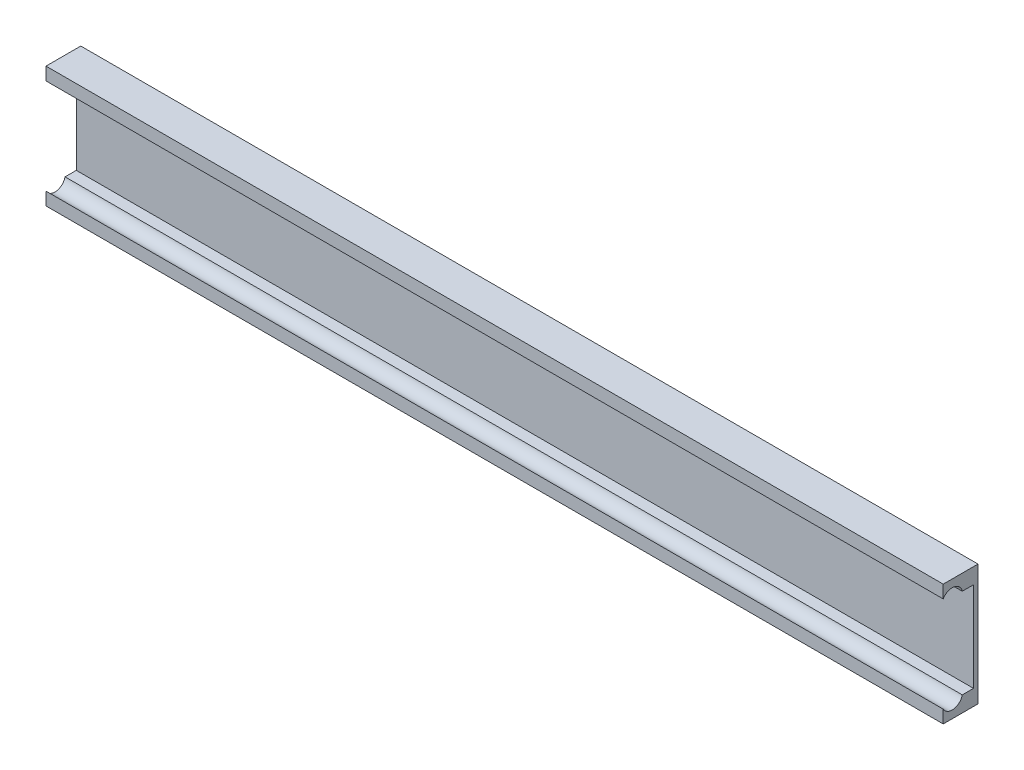
ISO-10303-21;
HEADER;
FILE_DESCRIPTION(('STEP AP214'),'2;1');
FILE_NAME('part.step','',(''),(''),'','','');
FILE_SCHEMA(('AUTOMOTIVE_DESIGN { 1 0 10303 214 1 1 1 1 }'));
ENDSEC;
DATA;
#1=APPLICATION_CONTEXT('core data for automotive mechanical design processes');
#2=APPLICATION_PROTOCOL_DEFINITION('international standard','automotive_design',2000,#1);
#3=PRODUCT_CONTEXT('',#1,'mechanical');
#4=PRODUCT('Part','Part','',(#3));
#5=PRODUCT_RELATED_PRODUCT_CATEGORY('part','',(#4));
#6=PRODUCT_DEFINITION_FORMATION('','',#4);
#7=PRODUCT_DEFINITION_CONTEXT('part definition',#1,'design');
#8=PRODUCT_DEFINITION('design','',#6,#7);
#9=PRODUCT_DEFINITION_SHAPE('','',#8);
#10=(LENGTH_UNIT() NAMED_UNIT(*) SI_UNIT(.MILLI.,.METRE.));
#11=(NAMED_UNIT(*) PLANE_ANGLE_UNIT() SI_UNIT($,.RADIAN.));
#12=(NAMED_UNIT(*) SI_UNIT($,.STERADIAN.) SOLID_ANGLE_UNIT());
#13=UNCERTAINTY_MEASURE_WITH_UNIT(LENGTH_MEASURE(1.E-05),#10,'distance_accuracy_value','');
#14=(GEOMETRIC_REPRESENTATION_CONTEXT(3) GLOBAL_UNCERTAINTY_ASSIGNED_CONTEXT((#13)) GLOBAL_UNIT_ASSIGNED_CONTEXT((#10,
#11,#12)) REPRESENTATION_CONTEXT('',''));
#15=CARTESIAN_POINT('',(0.,0.,0.));
#16=DIRECTION('',(0.,0.,1.));
#17=DIRECTION('',(1.,0.,0.));
#18=AXIS2_PLACEMENT_3D('',#15,#16,#17);
#19=CARTESIAN_POINT('',(100.,-10.,206.780622655632));
#20=DIRECTION('',(0.,-1.,0.));
#21=DIRECTION('',(1.,0.,0.));
#22=AXIS2_PLACEMENT_3D('',#19,#20,#21);
#23=PLANE('',#22);
#24=DIRECTION('',(1.,0.,0.));
#25=VECTOR('',#24,1.);
#26=CARTESIAN_POINT('',(-100.,-10.,2.50500556793565));
#27=LINE('',#26,#25);
#28=CARTESIAN_POINT('',(100.,-10.,2.50500556793564));
#29=VERTEX_POINT('',#28);
#30=CARTESIAN_POINT('',(-100.,-10.,2.50500556793565));
#31=VERTEX_POINT('',#30);
#32=EDGE_CURVE('E124',#29,#31,#27,.F.);
#33=ORIENTED_EDGE('',*,*,#32,.F.);
#34=DIRECTION('',(0.,0.,-1.));
#35=VECTOR('',#34,1.);
#36=CARTESIAN_POINT('',(100.,-10.,206.780622655632));
#37=LINE('',#36,#35);
#38=CARTESIAN_POINT('',(100.,-10.,0.));
#39=VERTEX_POINT('',#38);
#40=EDGE_CURVE('E133',#29,#39,#37,.T.);
#41=ORIENTED_EDGE('',*,*,#40,.T.);
#42=DIRECTION('',(-1.,0.,0.));
#43=VECTOR('',#42,1.);
#44=CARTESIAN_POINT('',(100.,-10.,0.));
#45=LINE('',#44,#43);
#46=CARTESIAN_POINT('',(-100.,-10.,0.));
#47=VERTEX_POINT('',#46);
#48=EDGE_CURVE('E143',#39,#47,#45,.T.);
#49=ORIENTED_EDGE('',*,*,#48,.T.);
#50=DIRECTION('',(0.,0.,-1.));
#51=VECTOR('',#50,1.);
#52=CARTESIAN_POINT('',(-100.,-10.,206.780622655632));
#53=LINE('',#52,#51);
#54=EDGE_CURVE('E135',#31,#47,#53,.T.);
#55=ORIENTED_EDGE('',*,*,#54,.F.);
#56=EDGE_LOOP('',(#33,#41,#49,#55));
#57=FACE_BOUND('',#56,.T.);
#58=ADVANCED_FACE('F43',(#57),#23,.F.);
#59=CARTESIAN_POINT('',(0.,0.,6.75));
#60=DIRECTION('',(0.,0.,1.));
#61=DIRECTION('',(1.,0.,0.));
#62=AXIS2_PLACEMENT_3D('',#59,#60,#61);
#63=PLANE('',#62);
#64=DIRECTION('',(0.,1.,0.));
#65=VECTOR('',#64,1.);
#66=CARTESIAN_POINT('',(100.,-13.5,6.75000000000001));
#67=LINE('',#66,#65);
#68=CARTESIAN_POINT('',(100.,-13.5,6.75000000000001));
#69=VERTEX_POINT('',#68);
#70=CARTESIAN_POINT('',(100.,-10.6357816691601,6.75));
#71=VERTEX_POINT('',#70);
#72=EDGE_CURVE('E157',#69,#71,#67,.T.);
#73=ORIENTED_EDGE('',*,*,#72,.T.);
#74=DIRECTION('',(1.,0.,0.));
#75=VECTOR('',#74,1.);
#76=CARTESIAN_POINT('',(-100.,-10.6357816691601,6.75));
#77=LINE('',#76,#75);
#78=CARTESIAN_POINT('',(-100.,-10.6357816691601,6.75000000000001));
#79=VERTEX_POINT('',#78);
#80=EDGE_CURVE('E11',#71,#79,#77,.F.);
#81=ORIENTED_EDGE('',*,*,#80,.T.);
#82=DIRECTION('',(0.,-1.,0.));
#83=VECTOR('',#82,1.);
#84=CARTESIAN_POINT('',(-100.,-13.5,6.75000000000001));
#85=LINE('',#84,#83);
#86=CARTESIAN_POINT('',(-100.,-13.5,6.75000000000006));
#87=VERTEX_POINT('',#86);
#88=EDGE_CURVE('E159',#79,#87,#85,.T.);
#89=ORIENTED_EDGE('',*,*,#88,.T.);
#90=DIRECTION('',(1.,0.,0.));
#91=VECTOR('',#90,1.);
#92=CARTESIAN_POINT('',(100.,-13.5,6.75000000000001));
#93=LINE('',#92,#91);
#94=EDGE_CURVE('E153',#87,#69,#93,.T.);
#95=ORIENTED_EDGE('',*,*,#94,.T.);
#96=EDGE_LOOP('',(#73,#81,#89,#95));
#97=FACE_BOUND('',#96,.T.);
#98=ADVANCED_FACE('F232',(#97),#63,.T.);
#99=CARTESIAN_POINT('',(0.,0.,0.));
#100=DIRECTION('',(0.,0.,1.));
#101=DIRECTION('',(1.,0.,0.));
#102=AXIS2_PLACEMENT_3D('',#99,#100,#101);
#103=PLANE('',#102);
#104=DIRECTION('',(0.,-1.,0.));
#105=VECTOR('',#104,1.);
#106=CARTESIAN_POINT('',(-100.,-13.5,0.));
#107=LINE('',#106,#105);
#108=CARTESIAN_POINT('',(-100.,10.,0.));
#109=VERTEX_POINT('',#108);
#110=EDGE_CURVE('E170',#109,#47,#107,.T.);
#111=ORIENTED_EDGE('',*,*,#110,.T.);
#112=ORIENTED_EDGE('',*,*,#48,.F.);
#113=DIRECTION('',(0.,1.,0.));
#114=VECTOR('',#113,1.);
#115=CARTESIAN_POINT('',(100.,-13.5,0.));
#116=LINE('',#115,#114);
#117=CARTESIAN_POINT('',(100.,10.,0.));
#118=VERTEX_POINT('',#117);
#119=EDGE_CURVE('E141',#39,#118,#116,.T.);
#120=ORIENTED_EDGE('',*,*,#119,.T.);
#121=DIRECTION('',(1.,0.,0.));
#122=VECTOR('',#121,1.);
#123=CARTESIAN_POINT('',(100.,10.,0.));
#124=LINE('',#123,#122);
#125=EDGE_CURVE('E162',#109,#118,#124,.T.);
#126=ORIENTED_EDGE('',*,*,#125,.F.);
#127=EDGE_LOOP('',(#111,#112,#120,#126));
#128=FACE_BOUND('',#127,.T.);
#129=ADVANCED_FACE('F240',(#128),#103,.T.);
#130=CARTESIAN_POINT('',(-100.,-13.5,-1.));
#131=DIRECTION('',(-1.,0.,0.));
#132=DIRECTION('',(0.,0.,1.));
#133=AXIS2_PLACEMENT_3D('',#130,#131,#132);
#134=PLANE('',#133);
#135=ORIENTED_EDGE('',*,*,#88,.F.);
#136=CARTESIAN_POINT('',(-100.,-9.5,4.75));
#137=DIRECTION('',(-1.,0.,0.));
#138=DIRECTION('',(0.,0.,-1.));
#139=AXIS2_PLACEMENT_3D('',#136,#137,#138);
#140=CIRCLE('',#139,2.3);
#141=EDGE_CURVE('E59',#31,#79,#140,.T.);
#142=ORIENTED_EDGE('',*,*,#141,.F.);
#143=ORIENTED_EDGE('',*,*,#54,.T.);
#144=ORIENTED_EDGE('',*,*,#110,.F.);
#145=DIRECTION('',(0.,0.,-1.));
#146=VECTOR('',#145,1.);
#147=CARTESIAN_POINT('',(-100.,10.,206.780622655632));
#148=LINE('',#147,#146);
#149=CARTESIAN_POINT('',(-100.,10.,2.50500556793564));
#150=VERTEX_POINT('',#149);
#151=EDGE_CURVE('E146',#150,#109,#148,.T.);
#152=ORIENTED_EDGE('',*,*,#151,.F.);
#153=CARTESIAN_POINT('',(-100.,9.5,4.75));
#154=DIRECTION('',(1.,0.,0.));
#155=DIRECTION('',(0.,0.,-1.));
#156=AXIS2_PLACEMENT_3D('',#153,#154,#155);
#157=CIRCLE('',#156,2.3);
#158=CARTESIAN_POINT('',(-100.,10.6357816691601,6.75));
#159=VERTEX_POINT('',#158);
#160=EDGE_CURVE('E208',#150,#159,#157,.T.);
#161=ORIENTED_EDGE('',*,*,#160,.T.);
#162=DIRECTION('',(0.,-1.,0.));
#163=VECTOR('',#162,1.);
#164=CARTESIAN_POINT('',(-100.,13.5,6.75000000000001));
#165=LINE('',#164,#163);
#166=CARTESIAN_POINT('',(-100.,13.5,6.75000000000006));
#167=VERTEX_POINT('',#166);
#168=EDGE_CURVE('E167',#167,#159,#165,.T.);
#169=ORIENTED_EDGE('',*,*,#168,.F.);
#170=DIRECTION('',(0.,0.,1.));
#171=VECTOR('',#170,1.);
#172=CARTESIAN_POINT('',(-100.,13.5,-1.));
#173=LINE('',#172,#171);
#174=CARTESIAN_POINT('',(-100.,13.5,-1.));
#175=VERTEX_POINT('',#174);
#176=EDGE_CURVE('E196',#175,#167,#173,.T.);
#177=ORIENTED_EDGE('',*,*,#176,.F.);
#178=DIRECTION('',(0.,-1.,0.));
#179=VECTOR('',#178,1.);
#180=CARTESIAN_POINT('',(-100.,-13.5,-1.));
#181=LINE('',#180,#179);
#182=CARTESIAN_POINT('',(-100.,-13.5,-1.));
#183=VERTEX_POINT('',#182);
#184=EDGE_CURVE('E178',#175,#183,#181,.T.);
#185=ORIENTED_EDGE('',*,*,#184,.T.);
#186=DIRECTION('',(0.,0.,1.));
#187=VECTOR('',#186,1.);
#188=CARTESIAN_POINT('',(-100.,-13.5,-1.));
#189=LINE('',#188,#187);
#190=EDGE_CURVE('E192',#183,#87,#189,.T.);
#191=ORIENTED_EDGE('',*,*,#190,.T.);
#192=EDGE_LOOP('',(#135,#142,#143,#144,#152,#161,#169,#177,#185,#191));
#193=FACE_BOUND('',#192,.T.);
#194=ADVANCED_FACE('F45',(#193),#134,.T.);
#195=CARTESIAN_POINT('',(100.,13.5,-1.));
#196=DIRECTION('',(0.,1.,0.));
#197=DIRECTION('',(0.,0.,1.));
#198=AXIS2_PLACEMENT_3D('',#195,#196,#197);
#199=PLANE('',#198);
#200=ORIENTED_EDGE('',*,*,#176,.T.);
#201=DIRECTION('',(-1.,0.,0.));
#202=VECTOR('',#201,1.);
#203=CARTESIAN_POINT('',(100.,13.5,6.75000000000001));
#204=LINE('',#203,#202);
#205=CARTESIAN_POINT('',(100.,13.5,6.75000000000006));
#206=VERTEX_POINT('',#205);
#207=EDGE_CURVE('E171',#206,#167,#204,.T.);
#208=ORIENTED_EDGE('',*,*,#207,.F.);
#209=DIRECTION('',(0.,0.,1.));
#210=VECTOR('',#209,1.);
#211=CARTESIAN_POINT('',(100.,13.5,-1.));
#212=LINE('',#211,#210);
#213=CARTESIAN_POINT('',(100.,13.5,-1.));
#214=VERTEX_POINT('',#213);
#215=EDGE_CURVE('E198',#214,#206,#212,.T.);
#216=ORIENTED_EDGE('',*,*,#215,.F.);
#217=DIRECTION('',(-1.,0.,0.));
#218=VECTOR('',#217,1.);
#219=CARTESIAN_POINT('',(100.,13.5,-1.));
#220=LINE('',#219,#218);
#221=EDGE_CURVE('E188',#214,#175,#220,.T.);
#222=ORIENTED_EDGE('',*,*,#221,.T.);
#223=EDGE_LOOP('',(#200,#208,#216,#222));
#224=FACE_BOUND('',#223,.T.);
#225=ADVANCED_FACE('F221',(#224),#199,.T.);
#226=CARTESIAN_POINT('',(100.,-13.5,-1.));
#227=DIRECTION('',(1.,0.,0.));
#228=DIRECTION('',(0.,0.,-1.));
#229=AXIS2_PLACEMENT_3D('',#226,#227,#228);
#230=PLANE('',#229);
#231=ORIENTED_EDGE('',*,*,#40,.F.);
#232=CARTESIAN_POINT('',(100.,-9.5,4.75));
#233=DIRECTION('',(-1.,0.,0.));
#234=DIRECTION('',(0.,0.,-1.));
#235=AXIS2_PLACEMENT_3D('',#232,#233,#234);
#236=CIRCLE('',#235,2.3);
#237=EDGE_CURVE('E121',#29,#71,#236,.T.);
#238=ORIENTED_EDGE('',*,*,#237,.T.);
#239=ORIENTED_EDGE('',*,*,#72,.F.);
#240=DIRECTION('',(0.,0.,1.));
#241=VECTOR('',#240,1.);
#242=CARTESIAN_POINT('',(100.,-13.5,-1.));
#243=LINE('',#242,#241);
#244=CARTESIAN_POINT('',(100.,-13.5,-1.));
#245=VERTEX_POINT('',#244);
#246=EDGE_CURVE('E202',#245,#69,#243,.T.);
#247=ORIENTED_EDGE('',*,*,#246,.F.);
#248=DIRECTION('',(0.,1.,0.));
#249=VECTOR('',#248,1.);
#250=CARTESIAN_POINT('',(100.,-13.5,-1.));
#251=LINE('',#250,#249);
#252=EDGE_CURVE('E185',#245,#214,#251,.T.);
#253=ORIENTED_EDGE('',*,*,#252,.T.);
#254=ORIENTED_EDGE('',*,*,#215,.T.);
#255=DIRECTION('',(0.,1.,0.));
#256=VECTOR('',#255,1.);
#257=CARTESIAN_POINT('',(100.,13.5,6.75000000000001));
#258=LINE('',#257,#256);
#259=CARTESIAN_POINT('',(100.,10.6357816691601,6.75000000000001));
#260=VERTEX_POINT('',#259);
#261=EDGE_CURVE('E166',#260,#206,#258,.T.);
#262=ORIENTED_EDGE('',*,*,#261,.F.);
#263=CARTESIAN_POINT('',(100.,9.5,4.75));
#264=DIRECTION('',(1.,0.,0.));
#265=DIRECTION('',(0.,0.,-1.));
#266=AXIS2_PLACEMENT_3D('',#263,#264,#265);
#267=CIRCLE('',#266,2.3);
#268=CARTESIAN_POINT('',(100.,10.,2.50500556793564));
#269=VERTEX_POINT('',#268);
#270=EDGE_CURVE('E68',#269,#260,#267,.T.);
#271=ORIENTED_EDGE('',*,*,#270,.F.);
#272=DIRECTION('',(0.,0.,-1.));
#273=VECTOR('',#272,1.);
#274=CARTESIAN_POINT('',(100.,10.,206.780622655632));
#275=LINE('',#274,#273);
#276=EDGE_CURVE('E142',#269,#118,#275,.T.);
#277=ORIENTED_EDGE('',*,*,#276,.T.);
#278=ORIENTED_EDGE('',*,*,#119,.F.);
#279=EDGE_LOOP('',(#231,#238,#239,#247,#253,#254,#262,#271,#277,#278));
#280=FACE_BOUND('',#279,.T.);
#281=ADVANCED_FACE('F139',(#280),#230,.T.);
#282=CARTESIAN_POINT('',(100.,-13.5,-1.));
#283=DIRECTION('',(0.,-1.,0.));
#284=DIRECTION('',(0.,0.,-1.));
#285=AXIS2_PLACEMENT_3D('',#282,#283,#284);
#286=PLANE('',#285);
#287=ORIENTED_EDGE('',*,*,#246,.T.);
#288=ORIENTED_EDGE('',*,*,#94,.F.);
#289=ORIENTED_EDGE('',*,*,#190,.F.);
#290=DIRECTION('',(1.,0.,0.));
#291=VECTOR('',#290,1.);
#292=CARTESIAN_POINT('',(100.,-13.5,-1.));
#293=LINE('',#292,#291);
#294=EDGE_CURVE('E181',#183,#245,#293,.T.);
#295=ORIENTED_EDGE('',*,*,#294,.T.);
#296=EDGE_LOOP('',(#287,#288,#289,#295));
#297=FACE_BOUND('',#296,.T.);
#298=ADVANCED_FACE('F229',(#297),#286,.T.);
#299=CARTESIAN_POINT('',(0.,0.,-1.));
#300=DIRECTION('',(0.,0.,1.));
#301=DIRECTION('',(1.,0.,0.));
#302=AXIS2_PLACEMENT_3D('',#299,#300,#301);
#303=PLANE('',#302);
#304=ORIENTED_EDGE('',*,*,#184,.F.);
#305=ORIENTED_EDGE('',*,*,#221,.F.);
#306=ORIENTED_EDGE('',*,*,#252,.F.);
#307=ORIENTED_EDGE('',*,*,#294,.F.);
#308=EDGE_LOOP('',(#304,#305,#306,#307));
#309=FACE_BOUND('',#308,.T.);
#310=ADVANCED_FACE('F226',(#309),#303,.F.);
#311=CARTESIAN_POINT('',(100.,10.,206.780622655632));
#312=DIRECTION('',(0.,1.,0.));
#313=DIRECTION('',(-1.,0.,0.));
#314=AXIS2_PLACEMENT_3D('',#311,#312,#313);
#315=PLANE('',#314);
#316=ORIENTED_EDGE('',*,*,#276,.F.);
#317=DIRECTION('',(1.,0.,0.));
#318=VECTOR('',#317,1.);
#319=CARTESIAN_POINT('',(-100.,10.,2.50500556793564));
#320=LINE('',#319,#318);
#321=EDGE_CURVE('E160',#269,#150,#320,.F.);
#322=ORIENTED_EDGE('',*,*,#321,.T.);
#323=ORIENTED_EDGE('',*,*,#151,.T.);
#324=ORIENTED_EDGE('',*,*,#125,.T.);
#325=EDGE_LOOP('',(#316,#322,#323,#324));
#326=FACE_BOUND('',#325,.T.);
#327=ADVANCED_FACE('F237',(#326),#315,.F.);
#328=CARTESIAN_POINT('',(0.,0.,6.75));
#329=DIRECTION('',(0.,0.,1.));
#330=DIRECTION('',(1.,0.,0.));
#331=AXIS2_PLACEMENT_3D('',#328,#329,#330);
#332=PLANE('',#331);
#333=DIRECTION('',(1.,0.,0.));
#334=VECTOR('',#333,1.);
#335=CARTESIAN_POINT('',(-100.,10.6357816691601,6.75));
#336=LINE('',#335,#334);
#337=EDGE_CURVE('E52',#260,#159,#336,.F.);
#338=ORIENTED_EDGE('',*,*,#337,.F.);
#339=ORIENTED_EDGE('',*,*,#261,.T.);
#340=ORIENTED_EDGE('',*,*,#207,.T.);
#341=ORIENTED_EDGE('',*,*,#168,.T.);
#342=EDGE_LOOP('',(#338,#339,#340,#341));
#343=FACE_BOUND('',#342,.T.);
#344=ADVANCED_FACE('F218',(#343),#332,.T.);
#345=CARTESIAN_POINT('',(-100.,9.5,4.75));
#346=DIRECTION('',(1.,0.,0.));
#347=DIRECTION('',(0.,0.,-1.));
#348=AXIS2_PLACEMENT_3D('',#345,#346,#347);
#349=CYLINDRICAL_SURFACE('',#348,2.3);
#350=ORIENTED_EDGE('',*,*,#270,.T.);
#351=ORIENTED_EDGE('',*,*,#337,.T.);
#352=ORIENTED_EDGE('',*,*,#160,.F.);
#353=ORIENTED_EDGE('',*,*,#321,.F.);
#354=EDGE_LOOP('',(#350,#351,#352,#353));
#355=FACE_BOUND('',#354,.T.);
#356=ADVANCED_FACE('F207',(#355),#349,.F.);
#357=CARTESIAN_POINT('',(-100.,-9.5,4.75));
#358=DIRECTION('',(1.,0.,0.));
#359=DIRECTION('',(0.,0.,-1.));
#360=AXIS2_PLACEMENT_3D('',#357,#358,#359);
#361=CYLINDRICAL_SURFACE('',#360,2.3);
#362=ORIENTED_EDGE('',*,*,#32,.T.);
#363=ORIENTED_EDGE('',*,*,#141,.T.);
#364=ORIENTED_EDGE('',*,*,#80,.F.);
#365=ORIENTED_EDGE('',*,*,#237,.F.);
#366=EDGE_LOOP('',(#362,#363,#364,#365));
#367=FACE_BOUND('',#366,.T.);
#368=ADVANCED_FACE('F123',(#367),#361,.F.);
#369=CLOSED_SHELL('',(#58,#98,#129,#194,#225,#281,#298,#310,#327,#344,#356,#368));
#370=MANIFOLD_SOLID_BREP('B2',#369);
#371=ADVANCED_BREP_SHAPE_REPRESENTATION('',(#18,#370),#14);
#372=SHAPE_DEFINITION_REPRESENTATION(#9,#371);
ENDSEC;
END-ISO-10303-21;
